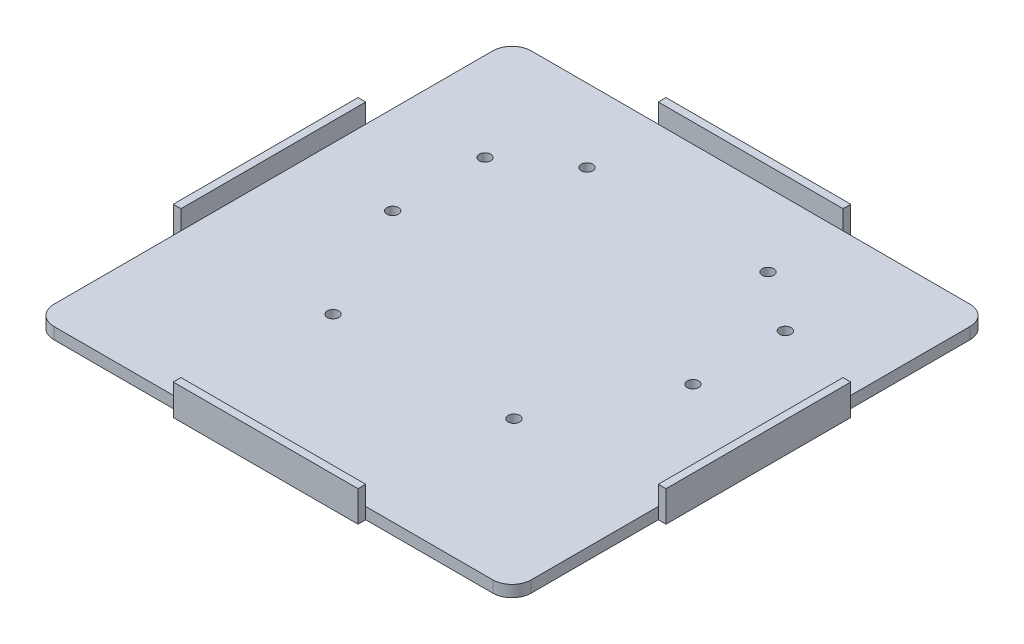
ISO-10303-21;
HEADER;
FILE_DESCRIPTION(('STEP AP214'),'2;1');
FILE_NAME('part.step','',(''),(''),'','','');
FILE_SCHEMA(('AUTOMOTIVE_DESIGN { 1 0 10303 214 1 1 1 1 }'));
ENDSEC;
DATA;
#1=APPLICATION_CONTEXT('core data for automotive mechanical design processes');
#2=APPLICATION_PROTOCOL_DEFINITION('international standard','automotive_design',2000,#1);
#3=PRODUCT_CONTEXT('',#1,'mechanical');
#4=PRODUCT('Part','Part','',(#3));
#5=PRODUCT_RELATED_PRODUCT_CATEGORY('part','',(#4));
#6=PRODUCT_DEFINITION_FORMATION('','',#4);
#7=PRODUCT_DEFINITION_CONTEXT('part definition',#1,'design');
#8=PRODUCT_DEFINITION('design','',#6,#7);
#9=PRODUCT_DEFINITION_SHAPE('','',#8);
#10=(LENGTH_UNIT() NAMED_UNIT(*) SI_UNIT(.MILLI.,.METRE.));
#11=(NAMED_UNIT(*) PLANE_ANGLE_UNIT() SI_UNIT($,.RADIAN.));
#12=(NAMED_UNIT(*) SI_UNIT($,.STERADIAN.) SOLID_ANGLE_UNIT());
#13=UNCERTAINTY_MEASURE_WITH_UNIT(LENGTH_MEASURE(1.E-05),#10,'distance_accuracy_value','');
#14=(GEOMETRIC_REPRESENTATION_CONTEXT(3) GLOBAL_UNCERTAINTY_ASSIGNED_CONTEXT((#13)) GLOBAL_UNIT_ASSIGNED_CONTEXT((#10,
#11,#12)) REPRESENTATION_CONTEXT('',''));
#15=CARTESIAN_POINT('',(0.,0.,0.));
#16=DIRECTION('',(0.,0.,1.));
#17=DIRECTION('',(1.,0.,0.));
#18=AXIS2_PLACEMENT_3D('',#15,#16,#17);
#19=CARTESIAN_POINT('',(0.,8.,0.));
#20=DIRECTION('',(0.,1.,0.));
#21=DIRECTION('',(0.,0.,1.));
#22=AXIS2_PLACEMENT_3D('',#19,#20,#21);
#23=PLANE('',#22);
#24=DIRECTION('',(0.,0.,1.));
#25=VECTOR('',#24,1.);
#26=CARTESIAN_POINT('',(-62.,8.,62.));
#27=LINE('',#26,#25);
#28=CARTESIAN_POINT('',(-62.,8.,-24.));
#29=VERTEX_POINT('',#28);
#30=CARTESIAN_POINT('',(-62.,8.,24.));
#31=VERTEX_POINT('',#30);
#32=EDGE_CURVE('E371',#29,#31,#27,.T.);
#33=ORIENTED_EDGE('',*,*,#32,.F.);
#34=DIRECTION('',(1.,0.,0.));
#35=VECTOR('',#34,1.);
#36=CARTESIAN_POINT('',(-64.,8.,-24.));
#37=LINE('',#36,#35);
#38=CARTESIAN_POINT('',(-64.,8.,-24.));
#39=VERTEX_POINT('',#38);
#40=EDGE_CURVE('E278',#39,#29,#37,.T.);
#41=ORIENTED_EDGE('',*,*,#40,.F.);
#42=DIRECTION('',(0.,0.,1.));
#43=VECTOR('',#42,1.);
#44=CARTESIAN_POINT('',(-64.,8.,-64.));
#45=LINE('',#44,#43);
#46=CARTESIAN_POINT('',(-64.,8.,24.));
#47=VERTEX_POINT('',#46);
#48=EDGE_CURVE('E300',#39,#47,#45,.T.);
#49=ORIENTED_EDGE('',*,*,#48,.T.);
#50=DIRECTION('',(-1.,0.,0.));
#51=VECTOR('',#50,1.);
#52=CARTESIAN_POINT('',(-64.,8.,24.));
#53=LINE('',#52,#51);
#54=EDGE_CURVE('E401',#31,#47,#53,.T.);
#55=ORIENTED_EDGE('',*,*,#54,.F.);
#56=EDGE_LOOP('',(#33,#41,#49,#55));
#57=FACE_BOUND('',#56,.T.);
#58=ADVANCED_FACE('F35',(#57),#23,.T.);
#59=DIRECTION('',(-1.,0.,0.));
#60=VECTOR('',#59,1.);
#61=CARTESIAN_POINT('',(-62.,8.,-62.));
#62=LINE('',#61,#60);
#63=CARTESIAN_POINT('',(24.,8.,-62.));
#64=VERTEX_POINT('',#63);
#65=CARTESIAN_POINT('',(-24.,8.,-62.));
#66=VERTEX_POINT('',#65);
#67=EDGE_CURVE('E223',#64,#66,#62,.T.);
#68=ORIENTED_EDGE('',*,*,#67,.F.);
#69=DIRECTION('',(0.,0.,1.));
#70=VECTOR('',#69,1.);
#71=CARTESIAN_POINT('',(24.,8.,-62.));
#72=LINE('',#71,#70);
#73=CARTESIAN_POINT('',(24.,8.,-64.));
#74=VERTEX_POINT('',#73);
#75=EDGE_CURVE('E239',#74,#64,#72,.T.);
#76=ORIENTED_EDGE('',*,*,#75,.F.);
#77=DIRECTION('',(-1.,0.,0.));
#78=VECTOR('',#77,1.);
#79=CARTESIAN_POINT('',(-64.,8.,-64.));
#80=LINE('',#79,#78);
#81=CARTESIAN_POINT('',(-24.,8.,-64.));
#82=VERTEX_POINT('',#81);
#83=EDGE_CURVE('E297',#74,#82,#80,.T.);
#84=ORIENTED_EDGE('',*,*,#83,.T.);
#85=DIRECTION('',(0.,0.,-1.));
#86=VECTOR('',#85,1.);
#87=CARTESIAN_POINT('',(-24.,8.,-62.));
#88=LINE('',#87,#86);
#89=EDGE_CURVE('E241',#66,#82,#88,.T.);
#90=ORIENTED_EDGE('',*,*,#89,.F.);
#91=EDGE_LOOP('',(#68,#76,#84,#90));
#92=FACE_BOUND('',#91,.T.);
#93=ADVANCED_FACE('F237',(#92),#23,.T.);
#94=DIRECTION('',(0.,0.,-1.));
#95=VECTOR('',#94,1.);
#96=CARTESIAN_POINT('',(62.,8.,-62.));
#97=LINE('',#96,#95);
#98=CARTESIAN_POINT('',(62.,8.,24.));
#99=VERTEX_POINT('',#98);
#100=CARTESIAN_POINT('',(62.,8.,-24.));
#101=VERTEX_POINT('',#100);
#102=EDGE_CURVE('E243',#99,#101,#97,.T.);
#103=ORIENTED_EDGE('',*,*,#102,.F.);
#104=DIRECTION('',(-1.,0.,0.));
#105=VECTOR('',#104,1.);
#106=CARTESIAN_POINT('',(64.,8.,24.));
#107=LINE('',#106,#105);
#108=CARTESIAN_POINT('',(64.,8.,24.));
#109=VERTEX_POINT('',#108);
#110=EDGE_CURVE('E427',#109,#99,#107,.T.);
#111=ORIENTED_EDGE('',*,*,#110,.F.);
#112=DIRECTION('',(0.,0.,-1.));
#113=VECTOR('',#112,1.);
#114=CARTESIAN_POINT('',(64.,8.,-64.));
#115=LINE('',#114,#113);
#116=CARTESIAN_POINT('',(64.,8.,-24.));
#117=VERTEX_POINT('',#116);
#118=EDGE_CURVE('E294',#109,#117,#115,.T.);
#119=ORIENTED_EDGE('',*,*,#118,.T.);
#120=DIRECTION('',(1.,0.,0.));
#121=VECTOR('',#120,1.);
#122=CARTESIAN_POINT('',(64.,8.,-24.));
#123=LINE('',#122,#121);
#124=EDGE_CURVE('E247',#101,#117,#123,.T.);
#125=ORIENTED_EDGE('',*,*,#124,.F.);
#126=EDGE_LOOP('',(#103,#111,#119,#125));
#127=FACE_BOUND('',#126,.T.);
#128=ADVANCED_FACE('F472',(#127),#23,.T.);
#129=CARTESIAN_POINT('',(64.,8.,-64.));
#130=DIRECTION('',(-1.,0.,0.));
#131=DIRECTION('',(0.,0.,1.));
#132=AXIS2_PLACEMENT_3D('',#129,#130,#131);
#133=PLANE('',#132);
#134=DIRECTION('',(0.,0.,-1.));
#135=VECTOR('',#134,1.);
#136=CARTESIAN_POINT('',(64.,0.,-64.));
#137=LINE('',#136,#135);
#138=CARTESIAN_POINT('',(64.,0.,24.));
#139=VERTEX_POINT('',#138);
#140=CARTESIAN_POINT('',(64.,0.,-24.));
#141=VERTEX_POINT('',#140);
#142=EDGE_CURVE('E286',#139,#141,#137,.T.);
#143=ORIENTED_EDGE('',*,*,#142,.T.);
#144=DIRECTION('',(0.,1.,0.));
#145=VECTOR('',#144,1.);
#146=CARTESIAN_POINT('',(64.,0.,-24.));
#147=LINE('',#146,#145);
#148=EDGE_CURVE('E259',#141,#117,#147,.T.);
#149=ORIENTED_EDGE('',*,*,#148,.T.);
#150=ORIENTED_EDGE('',*,*,#118,.F.);
#151=DIRECTION('',(0.,1.,0.));
#152=VECTOR('',#151,1.);
#153=CARTESIAN_POINT('',(64.,0.,24.));
#154=LINE('',#153,#152);
#155=EDGE_CURVE('E442',#139,#109,#154,.T.);
#156=ORIENTED_EDGE('',*,*,#155,.F.);
#157=EDGE_LOOP('',(#143,#149,#150,#156));
#158=FACE_BOUND('',#157,.T.);
#159=ADVANCED_FACE('F465',(#158),#133,.F.);
#160=CARTESIAN_POINT('',(-64.,8.,-64.));
#161=DIRECTION('',(0.,0.,1.));
#162=DIRECTION('',(1.,0.,0.));
#163=AXIS2_PLACEMENT_3D('',#160,#161,#162);
#164=PLANE('',#163);
#165=ORIENTED_EDGE('',*,*,#83,.F.);
#166=DIRECTION('',(0.,1.,0.));
#167=VECTOR('',#166,1.);
#168=CARTESIAN_POINT('',(24.,0.,-64.));
#169=LINE('',#168,#167);
#170=CARTESIAN_POINT('',(24.,0.,-64.));
#171=VERTEX_POINT('',#170);
#172=EDGE_CURVE('E232',#171,#74,#169,.T.);
#173=ORIENTED_EDGE('',*,*,#172,.F.);
#174=DIRECTION('',(-1.,0.,0.));
#175=VECTOR('',#174,1.);
#176=CARTESIAN_POINT('',(-64.,0.,-64.));
#177=LINE('',#176,#175);
#178=CARTESIAN_POINT('',(-24.,0.,-64.));
#179=VERTEX_POINT('',#178);
#180=EDGE_CURVE('E309',#171,#179,#177,.T.);
#181=ORIENTED_EDGE('',*,*,#180,.T.);
#182=DIRECTION('',(0.,1.,0.));
#183=VECTOR('',#182,1.);
#184=CARTESIAN_POINT('',(-24.,0.,-64.));
#185=LINE('',#184,#183);
#186=EDGE_CURVE('E283',#179,#82,#185,.T.);
#187=ORIENTED_EDGE('',*,*,#186,.T.);
#188=EDGE_LOOP('',(#165,#173,#181,#187));
#189=FACE_BOUND('',#188,.T.);
#190=ADVANCED_FACE('F504',(#189),#164,.F.);
#191=CARTESIAN_POINT('',(-64.,8.,-64.));
#192=DIRECTION('',(1.,0.,0.));
#193=DIRECTION('',(0.,0.,-1.));
#194=AXIS2_PLACEMENT_3D('',#191,#192,#193);
#195=PLANE('',#194);
#196=DIRECTION('',(0.,0.,1.));
#197=VECTOR('',#196,1.);
#198=CARTESIAN_POINT('',(-64.,0.,-64.));
#199=LINE('',#198,#197);
#200=CARTESIAN_POINT('',(-64.,0.,-24.));
#201=VERTEX_POINT('',#200);
#202=CARTESIAN_POINT('',(-64.,0.,24.));
#203=VERTEX_POINT('',#202);
#204=EDGE_CURVE('E312',#201,#203,#199,.T.);
#205=ORIENTED_EDGE('',*,*,#204,.T.);
#206=DIRECTION('',(0.,1.,0.));
#207=VECTOR('',#206,1.);
#208=CARTESIAN_POINT('',(-64.,0.,24.));
#209=LINE('',#208,#207);
#210=EDGE_CURVE('E281',#203,#47,#209,.T.);
#211=ORIENTED_EDGE('',*,*,#210,.T.);
#212=ORIENTED_EDGE('',*,*,#48,.F.);
#213=DIRECTION('',(0.,1.,0.));
#214=VECTOR('',#213,1.);
#215=CARTESIAN_POINT('',(-64.,0.,-24.));
#216=LINE('',#215,#214);
#217=EDGE_CURVE('E277',#201,#39,#216,.T.);
#218=ORIENTED_EDGE('',*,*,#217,.F.);
#219=EDGE_LOOP('',(#205,#211,#212,#218));
#220=FACE_BOUND('',#219,.T.);
#221=ADVANCED_FACE('F533',(#220),#195,.F.);
#222=CARTESIAN_POINT('',(-64.,8.,64.));
#223=DIRECTION('',(0.,0.,-1.));
#224=DIRECTION('',(-1.,0.,0.));
#225=AXIS2_PLACEMENT_3D('',#222,#223,#224);
#226=PLANE('',#225);
#227=DIRECTION('',(1.,0.,0.));
#228=VECTOR('',#227,1.);
#229=CARTESIAN_POINT('',(-64.,0.,64.));
#230=LINE('',#229,#228);
#231=CARTESIAN_POINT('',(-24.,0.,64.));
#232=VERTEX_POINT('',#231);
#233=CARTESIAN_POINT('',(24.,0.,64.));
#234=VERTEX_POINT('',#233);
#235=EDGE_CURVE('E298',#232,#234,#230,.T.);
#236=ORIENTED_EDGE('',*,*,#235,.T.);
#237=DIRECTION('',(0.,1.,0.));
#238=VECTOR('',#237,1.);
#239=CARTESIAN_POINT('',(24.,0.,64.));
#240=LINE('',#239,#238);
#241=CARTESIAN_POINT('',(24.,8.,64.));
#242=VERTEX_POINT('',#241);
#243=EDGE_CURVE('E444',#234,#242,#240,.T.);
#244=ORIENTED_EDGE('',*,*,#243,.T.);
#245=DIRECTION('',(1.,0.,0.));
#246=VECTOR('',#245,1.);
#247=CARTESIAN_POINT('',(-64.,8.,64.));
#248=LINE('',#247,#246);
#249=CARTESIAN_POINT('',(-24.,8.,64.));
#250=VERTEX_POINT('',#249);
#251=EDGE_CURVE('E303',#250,#242,#248,.T.);
#252=ORIENTED_EDGE('',*,*,#251,.F.);
#253=DIRECTION('',(0.,1.,0.));
#254=VECTOR('',#253,1.);
#255=CARTESIAN_POINT('',(-24.,0.,64.));
#256=LINE('',#255,#254);
#257=EDGE_CURVE('E409',#232,#250,#256,.T.);
#258=ORIENTED_EDGE('',*,*,#257,.F.);
#259=EDGE_LOOP('',(#236,#244,#252,#258));
#260=FACE_BOUND('',#259,.T.);
#261=ADVANCED_FACE('F563',(#260),#226,.F.);
#262=DIRECTION('',(1.,0.,0.));
#263=VECTOR('',#262,1.);
#264=CARTESIAN_POINT('',(62.,8.,62.));
#265=LINE('',#264,#263);
#266=CARTESIAN_POINT('',(-24.,8.,62.));
#267=VERTEX_POINT('',#266);
#268=CARTESIAN_POINT('',(24.,8.,62.));
#269=VERTEX_POINT('',#268);
#270=EDGE_CURVE('E374',#267,#269,#265,.T.);
#271=ORIENTED_EDGE('',*,*,#270,.F.);
#272=DIRECTION('',(0.,0.,-1.));
#273=VECTOR('',#272,1.);
#274=CARTESIAN_POINT('',(-24.,8.,62.));
#275=LINE('',#274,#273);
#276=EDGE_CURVE('E410',#250,#267,#275,.T.);
#277=ORIENTED_EDGE('',*,*,#276,.F.);
#278=ORIENTED_EDGE('',*,*,#251,.T.);
#279=DIRECTION('',(0.,0.,1.));
#280=VECTOR('',#279,1.);
#281=CARTESIAN_POINT('',(24.,8.,62.));
#282=LINE('',#281,#280);
#283=EDGE_CURVE('E262',#269,#242,#282,.T.);
#284=ORIENTED_EDGE('',*,*,#283,.F.);
#285=EDGE_LOOP('',(#271,#277,#278,#284));
#286=FACE_BOUND('',#285,.T.);
#287=ADVANCED_FACE('F571',(#286),#23,.T.);
#288=CARTESIAN_POINT('',(0.,0.,0.));
#289=DIRECTION('',(0.,1.,0.));
#290=DIRECTION('',(0.,0.,1.));
#291=AXIS2_PLACEMENT_3D('',#288,#289,#290);
#292=PLANE('',#291);
#293=CARTESIAN_POINT('',(-39.,0.,-32.));
#294=DIRECTION('',(0.,-1.,0.));
#295=DIRECTION('',(0.,0.,-1.));
#296=AXIS2_PLACEMENT_3D('',#293,#294,#295);
#297=CIRCLE('',#296,1.5);
#298=CARTESIAN_POINT('',(-39.,0.,-33.5));
#299=VERTEX_POINT('',#298);
#300=EDGE_CURVE('E924',#299,#299,#297,.T.);
#301=ORIENTED_EDGE('',*,*,#300,.F.);
#302=EDGE_LOOP('',(#301));
#303=FACE_BOUND('',#302,.T.);
#304=CARTESIAN_POINT('',(23.5,0.,23.));
#305=DIRECTION('',(0.,-1.,0.));
#306=DIRECTION('',(0.,0.,1.));
#307=AXIS2_PLACEMENT_3D('',#304,#305,#306);
#308=CIRCLE('',#307,1.5);
#309=CARTESIAN_POINT('',(23.5,0.,24.5));
#310=VERTEX_POINT('',#309);
#311=EDGE_CURVE('E925',#310,#310,#308,.T.);
#312=ORIENTED_EDGE('',*,*,#311,.F.);
#313=EDGE_LOOP('',(#312));
#314=FACE_BOUND('',#313,.T.);
#315=CARTESIAN_POINT('',(-23.5,0.,23.));
#316=DIRECTION('',(0.,-1.,0.));
#317=DIRECTION('',(0.,0.,-1.));
#318=AXIS2_PLACEMENT_3D('',#315,#316,#317);
#319=CIRCLE('',#318,1.5);
#320=CARTESIAN_POINT('',(-23.5,0.,21.5));
#321=VERTEX_POINT('',#320);
#322=EDGE_CURVE('E929',#321,#321,#319,.T.);
#323=ORIENTED_EDGE('',*,*,#322,.F.);
#324=EDGE_LOOP('',(#323));
#325=FACE_BOUND('',#324,.T.);
#326=CARTESIAN_POINT('',(23.5,0.,-43.));
#327=DIRECTION('',(0.,-1.,0.));
#328=DIRECTION('',(0.,0.,1.));
#329=AXIS2_PLACEMENT_3D('',#326,#327,#328);
#330=CIRCLE('',#329,1.5);
#331=CARTESIAN_POINT('',(23.5,0.,-41.5));
#332=VERTEX_POINT('',#331);
#333=EDGE_CURVE('E936',#332,#332,#330,.T.);
#334=ORIENTED_EDGE('',*,*,#333,.F.);
#335=EDGE_LOOP('',(#334));
#336=FACE_BOUND('',#335,.T.);
#337=CARTESIAN_POINT('',(39.,0.,-7.99999999999998));
#338=DIRECTION('',(0.,-1.,0.));
#339=DIRECTION('',(0.,0.,1.));
#340=AXIS2_PLACEMENT_3D('',#337,#338,#339);
#341=CIRCLE('',#340,1.5);
#342=CARTESIAN_POINT('',(39.,0.,-6.49999999999998));
#343=VERTEX_POINT('',#342);
#344=EDGE_CURVE('E955',#343,#343,#341,.T.);
#345=ORIENTED_EDGE('',*,*,#344,.F.);
#346=EDGE_LOOP('',(#345));
#347=FACE_BOUND('',#346,.T.);
#348=CARTESIAN_POINT('',(-39.,0.,-7.99999999999999));
#349=DIRECTION('',(0.,-1.,0.));
#350=DIRECTION('',(0.,0.,-1.));
#351=AXIS2_PLACEMENT_3D('',#348,#349,#350);
#352=CIRCLE('',#351,1.5);
#353=CARTESIAN_POINT('',(-39.,0.,-9.5));
#354=VERTEX_POINT('',#353);
#355=EDGE_CURVE('E932',#354,#354,#352,.T.);
#356=ORIENTED_EDGE('',*,*,#355,.F.);
#357=EDGE_LOOP('',(#356));
#358=FACE_BOUND('',#357,.T.);
#359=CARTESIAN_POINT('',(39.,0.,-32.));
#360=DIRECTION('',(0.,-1.,0.));
#361=DIRECTION('',(0.,0.,1.));
#362=AXIS2_PLACEMENT_3D('',#359,#360,#361);
#363=CIRCLE('',#362,1.5);
#364=CARTESIAN_POINT('',(39.,0.,-30.5));
#365=VERTEX_POINT('',#364);
#366=EDGE_CURVE('E926',#365,#365,#363,.T.);
#367=ORIENTED_EDGE('',*,*,#366,.F.);
#368=EDGE_LOOP('',(#367));
#369=FACE_BOUND('',#368,.T.);
#370=CARTESIAN_POINT('',(-23.5,0.,-43.));
#371=DIRECTION('',(0.,-1.,0.));
#372=DIRECTION('',(0.,0.,-1.));
#373=AXIS2_PLACEMENT_3D('',#370,#371,#372);
#374=CIRCLE('',#373,1.5);
#375=CARTESIAN_POINT('',(-23.5,0.,-44.5));
#376=VERTEX_POINT('',#375);
#377=EDGE_CURVE('E352',#376,#376,#374,.T.);
#378=ORIENTED_EDGE('',*,*,#377,.F.);
#379=EDGE_LOOP('',(#378));
#380=FACE_BOUND('',#379,.T.);
#381=DIRECTION('',(0.,0.,-1.));
#382=VECTOR('',#381,1.);
#383=CARTESIAN_POINT('',(-62.,0.,-24.));
#384=LINE('',#383,#382);
#385=CARTESIAN_POINT('',(-62.,0.,-24.));
#386=VERTEX_POINT('',#385);
#387=CARTESIAN_POINT('',(-62.,0.,-57.));
#388=VERTEX_POINT('',#387);
#389=EDGE_CURVE('E270',#386,#388,#384,.T.);
#390=ORIENTED_EDGE('',*,*,#389,.T.);
#391=CARTESIAN_POINT('',(-57.,0.,-57.));
#392=DIRECTION('',(0.,1.,0.));
#393=DIRECTION('',(0.,0.,1.));
#394=AXIS2_PLACEMENT_3D('',#391,#392,#393);
#395=CIRCLE('',#394,5.);
#396=CARTESIAN_POINT('',(-57.,0.,-62.));
#397=VERTEX_POINT('',#396);
#398=EDGE_CURVE('E11',#388,#397,#395,.F.);
#399=ORIENTED_EDGE('',*,*,#398,.T.);
#400=DIRECTION('',(1.,0.,0.));
#401=VECTOR('',#400,1.);
#402=CARTESIAN_POINT('',(-62.,0.,-62.));
#403=LINE('',#402,#401);
#404=CARTESIAN_POINT('',(-24.,0.,-62.));
#405=VERTEX_POINT('',#404);
#406=EDGE_CURVE('E272',#397,#405,#403,.T.);
#407=ORIENTED_EDGE('',*,*,#406,.T.);
#408=DIRECTION('',(0.,0.,-1.));
#409=VECTOR('',#408,1.);
#410=CARTESIAN_POINT('',(-24.,0.,-62.));
#411=LINE('',#410,#409);
#412=EDGE_CURVE('E274',#405,#179,#411,.T.);
#413=ORIENTED_EDGE('',*,*,#412,.T.);
#414=ORIENTED_EDGE('',*,*,#180,.F.);
#415=DIRECTION('',(0.,0.,1.));
#416=VECTOR('',#415,1.);
#417=CARTESIAN_POINT('',(24.,0.,-62.));
#418=LINE('',#417,#416);
#419=CARTESIAN_POINT('',(24.,0.,-62.));
#420=VERTEX_POINT('',#419);
#421=EDGE_CURVE('E250',#171,#420,#418,.T.);
#422=ORIENTED_EDGE('',*,*,#421,.T.);
#423=DIRECTION('',(1.,0.,0.));
#424=VECTOR('',#423,1.);
#425=CARTESIAN_POINT('',(62.,0.,-62.));
#426=LINE('',#425,#424);
#427=CARTESIAN_POINT('',(57.,0.,-62.));
#428=VERTEX_POINT('',#427);
#429=EDGE_CURVE('E452',#420,#428,#426,.T.);
#430=ORIENTED_EDGE('',*,*,#429,.T.);
#431=CARTESIAN_POINT('',(57.,0.,-57.));
#432=DIRECTION('',(0.,1.,0.));
#433=DIRECTION('',(0.,0.,1.));
#434=AXIS2_PLACEMENT_3D('',#431,#432,#433);
#435=CIRCLE('',#434,5.);
#436=CARTESIAN_POINT('',(62.,0.,-57.));
#437=VERTEX_POINT('',#436);
#438=EDGE_CURVE('E341',#428,#437,#435,.F.);
#439=ORIENTED_EDGE('',*,*,#438,.T.);
#440=DIRECTION('',(0.,0.,1.));
#441=VECTOR('',#440,1.);
#442=CARTESIAN_POINT('',(62.,0.,-24.));
#443=LINE('',#442,#441);
#444=CARTESIAN_POINT('',(62.,0.,-24.));
#445=VERTEX_POINT('',#444);
#446=EDGE_CURVE('E454',#437,#445,#443,.T.);
#447=ORIENTED_EDGE('',*,*,#446,.T.);
#448=DIRECTION('',(1.,0.,0.));
#449=VECTOR('',#448,1.);
#450=CARTESIAN_POINT('',(64.,0.,-24.));
#451=LINE('',#450,#449);
#452=EDGE_CURVE('E256',#445,#141,#451,.T.);
#453=ORIENTED_EDGE('',*,*,#452,.T.);
#454=ORIENTED_EDGE('',*,*,#142,.F.);
#455=DIRECTION('',(-1.,0.,0.));
#456=VECTOR('',#455,1.);
#457=CARTESIAN_POINT('',(64.,0.,24.));
#458=LINE('',#457,#456);
#459=CARTESIAN_POINT('',(62.,0.,24.));
#460=VERTEX_POINT('',#459);
#461=EDGE_CURVE('E430',#139,#460,#458,.T.);
#462=ORIENTED_EDGE('',*,*,#461,.T.);
#463=DIRECTION('',(0.,0.,1.));
#464=VECTOR('',#463,1.);
#465=CARTESIAN_POINT('',(62.,0.,24.));
#466=LINE('',#465,#464);
#467=CARTESIAN_POINT('',(62.,0.,57.));
#468=VERTEX_POINT('',#467);
#469=EDGE_CURVE('E433',#460,#468,#466,.T.);
#470=ORIENTED_EDGE('',*,*,#469,.T.);
#471=CARTESIAN_POINT('',(57.,0.,57.));
#472=DIRECTION('',(0.,1.,0.));
#473=DIRECTION('',(0.,0.,1.));
#474=AXIS2_PLACEMENT_3D('',#471,#472,#473);
#475=CIRCLE('',#474,5.);
#476=CARTESIAN_POINT('',(57.,0.,62.));
#477=VERTEX_POINT('',#476);
#478=EDGE_CURVE('E332',#468,#477,#475,.F.);
#479=ORIENTED_EDGE('',*,*,#478,.T.);
#480=DIRECTION('',(-1.,0.,0.));
#481=VECTOR('',#480,1.);
#482=CARTESIAN_POINT('',(62.,0.,62.));
#483=LINE('',#482,#481);
#484=CARTESIAN_POINT('',(24.,0.,62.));
#485=VERTEX_POINT('',#484);
#486=EDGE_CURVE('E424',#477,#485,#483,.T.);
#487=ORIENTED_EDGE('',*,*,#486,.T.);
#488=DIRECTION('',(0.,0.,1.));
#489=VECTOR('',#488,1.);
#490=CARTESIAN_POINT('',(24.,0.,62.));
#491=LINE('',#490,#489);
#492=EDGE_CURVE('E426',#485,#234,#491,.T.);
#493=ORIENTED_EDGE('',*,*,#492,.T.);
#494=ORIENTED_EDGE('',*,*,#235,.F.);
#495=DIRECTION('',(0.,0.,-1.));
#496=VECTOR('',#495,1.);
#497=CARTESIAN_POINT('',(-24.,0.,62.));
#498=LINE('',#497,#496);
#499=CARTESIAN_POINT('',(-24.,0.,62.));
#500=VERTEX_POINT('',#499);
#501=EDGE_CURVE('E397',#232,#500,#498,.T.);
#502=ORIENTED_EDGE('',*,*,#501,.T.);
#503=DIRECTION('',(-1.,0.,0.));
#504=VECTOR('',#503,1.);
#505=CARTESIAN_POINT('',(-62.,0.,62.));
#506=LINE('',#505,#504);
#507=CARTESIAN_POINT('',(-57.,0.,62.));
#508=VERTEX_POINT('',#507);
#509=EDGE_CURVE('E400',#500,#508,#506,.T.);
#510=ORIENTED_EDGE('',*,*,#509,.T.);
#511=CARTESIAN_POINT('',(-57.,0.,57.));
#512=DIRECTION('',(0.,1.,0.));
#513=DIRECTION('',(0.,0.,1.));
#514=AXIS2_PLACEMENT_3D('',#511,#512,#513);
#515=CIRCLE('',#514,5.);
#516=CARTESIAN_POINT('',(-62.,0.,57.));
#517=VERTEX_POINT('',#516);
#518=EDGE_CURVE('E323',#508,#517,#515,.F.);
#519=ORIENTED_EDGE('',*,*,#518,.T.);
#520=DIRECTION('',(0.,0.,-1.));
#521=VECTOR('',#520,1.);
#522=CARTESIAN_POINT('',(-62.,0.,24.));
#523=LINE('',#522,#521);
#524=CARTESIAN_POINT('',(-62.,0.,24.));
#525=VERTEX_POINT('',#524);
#526=EDGE_CURVE('E404',#517,#525,#523,.T.);
#527=ORIENTED_EDGE('',*,*,#526,.T.);
#528=DIRECTION('',(-1.,0.,0.));
#529=VECTOR('',#528,1.);
#530=CARTESIAN_POINT('',(-64.,0.,24.));
#531=LINE('',#530,#529);
#532=EDGE_CURVE('E406',#525,#203,#531,.T.);
#533=ORIENTED_EDGE('',*,*,#532,.T.);
#534=ORIENTED_EDGE('',*,*,#204,.F.);
#535=DIRECTION('',(1.,0.,0.));
#536=VECTOR('',#535,1.);
#537=CARTESIAN_POINT('',(-64.,0.,-24.));
#538=LINE('',#537,#536);
#539=EDGE_CURVE('E267',#201,#386,#538,.T.);
#540=ORIENTED_EDGE('',*,*,#539,.T.);
#541=EDGE_LOOP('',(#390,#399,#407,#413,#414,#422,#430,#439,#447,#453,#454,#462,#470,#479,#487,
#493,#494,#502,#510,#519,#527,#533,#534,#540));
#542=FACE_BOUND('',#541,.T.);
#543=ADVANCED_FACE('F461',(#303,#314,#325,#336,#347,#358,#369,#380,#542),#292,.F.);
#544=CARTESIAN_POINT('',(-24.,0.,-62.));
#545=DIRECTION('',(1.,0.,0.));
#546=DIRECTION('',(0.,0.,-1.));
#547=AXIS2_PLACEMENT_3D('',#544,#545,#546);
#548=PLANE('',#547);
#549=ORIENTED_EDGE('',*,*,#89,.T.);
#550=ORIENTED_EDGE('',*,*,#186,.F.);
#551=ORIENTED_EDGE('',*,*,#412,.F.);
#552=DIRECTION('',(0.,1.,0.));
#553=VECTOR('',#552,1.);
#554=CARTESIAN_POINT('',(-24.,0.,-62.));
#555=LINE('',#554,#553);
#556=CARTESIAN_POINT('',(-24.,3.,-62.));
#557=VERTEX_POINT('',#556);
#558=EDGE_CURVE('E287',#405,#557,#555,.T.);
#559=ORIENTED_EDGE('',*,*,#558,.T.);
#560=DIRECTION('',(0.,1.,0.));
#561=VECTOR('',#560,1.);
#562=CARTESIAN_POINT('',(-24.,0.,-62.));
#563=LINE('',#562,#561);
#564=EDGE_CURVE('E385',#557,#66,#563,.T.);
#565=ORIENTED_EDGE('',*,*,#564,.T.);
#566=EDGE_LOOP('',(#549,#550,#551,#559,#565));
#567=FACE_BOUND('',#566,.T.);
#568=ADVANCED_FACE('F509',(#567),#548,.F.);
#569=CARTESIAN_POINT('',(-62.,0.,-62.));
#570=DIRECTION('',(0.,0.,1.));
#571=DIRECTION('',(1.,0.,0.));
#572=AXIS2_PLACEMENT_3D('',#569,#570,#571);
#573=PLANE('',#572);
#574=ORIENTED_EDGE('',*,*,#406,.F.);
#575=DIRECTION('',(0.,1.,0.));
#576=VECTOR('',#575,1.);
#577=CARTESIAN_POINT('',(-57.,0.,-62.));
#578=LINE('',#577,#576);
#579=CARTESIAN_POINT('',(-57.,3.,-62.));
#580=VERTEX_POINT('',#579);
#581=EDGE_CURVE('E343',#397,#580,#578,.T.);
#582=ORIENTED_EDGE('',*,*,#581,.T.);
#583=DIRECTION('',(-1.,0.,0.));
#584=VECTOR('',#583,1.);
#585=CARTESIAN_POINT('',(-62.,3.,-62.));
#586=LINE('',#585,#584);
#587=EDGE_CURVE('E491',#557,#580,#586,.T.);
#588=ORIENTED_EDGE('',*,*,#587,.F.);
#589=ORIENTED_EDGE('',*,*,#558,.F.);
#590=EDGE_LOOP('',(#574,#582,#588,#589));
#591=FACE_BOUND('',#590,.T.);
#592=ADVANCED_FACE('F511',(#591),#573,.F.);
#593=CARTESIAN_POINT('',(-62.,0.,-24.));
#594=DIRECTION('',(1.,0.,0.));
#595=DIRECTION('',(0.,0.,-1.));
#596=AXIS2_PLACEMENT_3D('',#593,#594,#595);
#597=PLANE('',#596);
#598=DIRECTION('',(0.,0.,1.));
#599=VECTOR('',#598,1.);
#600=CARTESIAN_POINT('',(-62.,3.,62.));
#601=LINE('',#600,#599);
#602=CARTESIAN_POINT('',(-62.,3.,-57.));
#603=VERTEX_POINT('',#602);
#604=CARTESIAN_POINT('',(-62.,3.,-24.));
#605=VERTEX_POINT('',#604);
#606=EDGE_CURVE('E542',#603,#605,#601,.T.);
#607=ORIENTED_EDGE('',*,*,#606,.F.);
#608=DIRECTION('',(0.,1.,0.));
#609=VECTOR('',#608,1.);
#610=CARTESIAN_POINT('',(-62.,0.,-57.));
#611=LINE('',#610,#609);
#612=EDGE_CURVE('E44',#603,#388,#611,.F.);
#613=ORIENTED_EDGE('',*,*,#612,.T.);
#614=ORIENTED_EDGE('',*,*,#389,.F.);
#615=DIRECTION('',(0.,1.,0.));
#616=VECTOR('',#615,1.);
#617=CARTESIAN_POINT('',(-62.,0.,-24.));
#618=LINE('',#617,#616);
#619=EDGE_CURVE('E290',#386,#605,#618,.T.);
#620=ORIENTED_EDGE('',*,*,#619,.T.);
#621=EDGE_LOOP('',(#607,#613,#614,#620));
#622=FACE_BOUND('',#621,.T.);
#623=ADVANCED_FACE('F517',(#622),#597,.F.);
#624=CARTESIAN_POINT('',(-64.,0.,-24.));
#625=DIRECTION('',(0.,0.,1.));
#626=DIRECTION('',(1.,0.,0.));
#627=AXIS2_PLACEMENT_3D('',#624,#625,#626);
#628=PLANE('',#627);
#629=ORIENTED_EDGE('',*,*,#40,.T.);
#630=DIRECTION('',(0.,-1.,0.));
#631=VECTOR('',#630,1.);
#632=CARTESIAN_POINT('',(-62.,0.,-24.));
#633=LINE('',#632,#631);
#634=EDGE_CURVE('E248',#29,#605,#633,.T.);
#635=ORIENTED_EDGE('',*,*,#634,.T.);
#636=ORIENTED_EDGE('',*,*,#619,.F.);
#637=ORIENTED_EDGE('',*,*,#539,.F.);
#638=ORIENTED_EDGE('',*,*,#217,.T.);
#639=EDGE_LOOP('',(#629,#635,#636,#637,#638));
#640=FACE_BOUND('',#639,.T.);
#641=ADVANCED_FACE('F519',(#640),#628,.F.);
#642=CARTESIAN_POINT('',(-64.,0.,24.));
#643=DIRECTION('',(0.,0.,-1.));
#644=DIRECTION('',(-1.,0.,0.));
#645=AXIS2_PLACEMENT_3D('',#642,#643,#644);
#646=PLANE('',#645);
#647=ORIENTED_EDGE('',*,*,#54,.T.);
#648=ORIENTED_EDGE('',*,*,#210,.F.);
#649=ORIENTED_EDGE('',*,*,#532,.F.);
#650=DIRECTION('',(0.,1.,0.));
#651=VECTOR('',#650,1.);
#652=CARTESIAN_POINT('',(-62.,0.,24.));
#653=LINE('',#652,#651);
#654=CARTESIAN_POINT('',(-62.,3.,24.));
#655=VERTEX_POINT('',#654);
#656=EDGE_CURVE('E417',#525,#655,#653,.T.);
#657=ORIENTED_EDGE('',*,*,#656,.T.);
#658=DIRECTION('',(0.,1.,0.));
#659=VECTOR('',#658,1.);
#660=CARTESIAN_POINT('',(-62.,0.,24.));
#661=LINE('',#660,#659);
#662=EDGE_CURVE('E253',#655,#31,#661,.T.);
#663=ORIENTED_EDGE('',*,*,#662,.T.);
#664=EDGE_LOOP('',(#647,#648,#649,#657,#663));
#665=FACE_BOUND('',#664,.T.);
#666=ADVANCED_FACE('F530',(#665),#646,.F.);
#667=CARTESIAN_POINT('',(-62.,0.,24.));
#668=DIRECTION('',(1.,0.,0.));
#669=DIRECTION('',(0.,0.,-1.));
#670=AXIS2_PLACEMENT_3D('',#667,#668,#669);
#671=PLANE('',#670);
#672=ORIENTED_EDGE('',*,*,#526,.F.);
#673=DIRECTION('',(0.,1.,0.));
#674=VECTOR('',#673,1.);
#675=CARTESIAN_POINT('',(-62.,0.,57.));
#676=LINE('',#675,#674);
#677=CARTESIAN_POINT('',(-62.,3.,57.));
#678=VERTEX_POINT('',#677);
#679=EDGE_CURVE('E306',#517,#678,#676,.T.);
#680=ORIENTED_EDGE('',*,*,#679,.T.);
#681=EDGE_CURVE('E242',#655,#678,#601,.T.);
#682=ORIENTED_EDGE('',*,*,#681,.F.);
#683=ORIENTED_EDGE('',*,*,#656,.F.);
#684=EDGE_LOOP('',(#672,#680,#682,#683));
#685=FACE_BOUND('',#684,.T.);
#686=ADVANCED_FACE('F538',(#685),#671,.F.);
#687=CARTESIAN_POINT('',(-62.,0.,62.));
#688=DIRECTION('',(0.,0.,-1.));
#689=DIRECTION('',(-1.,0.,0.));
#690=AXIS2_PLACEMENT_3D('',#687,#688,#689);
#691=PLANE('',#690);
#692=DIRECTION('',(1.,0.,0.));
#693=VECTOR('',#692,1.);
#694=CARTESIAN_POINT('',(62.,3.,62.));
#695=LINE('',#694,#693);
#696=CARTESIAN_POINT('',(-57.,3.,62.));
#697=VERTEX_POINT('',#696);
#698=CARTESIAN_POINT('',(-24.,3.,62.));
#699=VERTEX_POINT('',#698);
#700=EDGE_CURVE('E486',#697,#699,#695,.T.);
#701=ORIENTED_EDGE('',*,*,#700,.F.);
#702=DIRECTION('',(0.,1.,0.));
#703=VECTOR('',#702,1.);
#704=CARTESIAN_POINT('',(-57.,0.,62.));
#705=LINE('',#704,#703);
#706=EDGE_CURVE('E321',#697,#508,#705,.F.);
#707=ORIENTED_EDGE('',*,*,#706,.T.);
#708=ORIENTED_EDGE('',*,*,#509,.F.);
#709=DIRECTION('',(0.,1.,0.));
#710=VECTOR('',#709,1.);
#711=CARTESIAN_POINT('',(-24.,0.,62.));
#712=LINE('',#711,#710);
#713=EDGE_CURVE('E420',#500,#699,#712,.T.);
#714=ORIENTED_EDGE('',*,*,#713,.T.);
#715=EDGE_LOOP('',(#701,#707,#708,#714));
#716=FACE_BOUND('',#715,.T.);
#717=ADVANCED_FACE('F574',(#716),#691,.F.);
#718=CARTESIAN_POINT('',(-24.,0.,62.));
#719=DIRECTION('',(1.,0.,0.));
#720=DIRECTION('',(0.,0.,-1.));
#721=AXIS2_PLACEMENT_3D('',#718,#719,#720);
#722=PLANE('',#721);
#723=ORIENTED_EDGE('',*,*,#276,.T.);
#724=DIRECTION('',(0.,-1.,0.));
#725=VECTOR('',#724,1.);
#726=CARTESIAN_POINT('',(-24.,0.,62.));
#727=LINE('',#726,#725);
#728=EDGE_CURVE('E393',#267,#699,#727,.T.);
#729=ORIENTED_EDGE('',*,*,#728,.T.);
#730=ORIENTED_EDGE('',*,*,#713,.F.);
#731=ORIENTED_EDGE('',*,*,#501,.F.);
#732=ORIENTED_EDGE('',*,*,#257,.T.);
#733=EDGE_LOOP('',(#723,#729,#730,#731,#732));
#734=FACE_BOUND('',#733,.T.);
#735=ADVANCED_FACE('F567',(#734),#722,.F.);
#736=CARTESIAN_POINT('',(62.,0.,62.));
#737=DIRECTION('',(0.,0.,-1.));
#738=DIRECTION('',(-1.,0.,0.));
#739=AXIS2_PLACEMENT_3D('',#736,#737,#738);
#740=PLANE('',#739);
#741=ORIENTED_EDGE('',*,*,#486,.F.);
#742=DIRECTION('',(0.,1.,0.));
#743=VECTOR('',#742,1.);
#744=CARTESIAN_POINT('',(57.,0.,62.));
#745=LINE('',#744,#743);
#746=CARTESIAN_POINT('',(57.,3.,62.));
#747=VERTEX_POINT('',#746);
#748=EDGE_CURVE('E325',#477,#747,#745,.T.);
#749=ORIENTED_EDGE('',*,*,#748,.T.);
#750=CARTESIAN_POINT('',(24.,3.,62.));
#751=VERTEX_POINT('',#750);
#752=EDGE_CURVE('E490',#751,#747,#695,.T.);
#753=ORIENTED_EDGE('',*,*,#752,.F.);
#754=DIRECTION('',(0.,1.,0.));
#755=VECTOR('',#754,1.);
#756=CARTESIAN_POINT('',(24.,0.,62.));
#757=LINE('',#756,#755);
#758=EDGE_CURVE('E447',#485,#751,#757,.T.);
#759=ORIENTED_EDGE('',*,*,#758,.F.);
#760=EDGE_LOOP('',(#741,#749,#753,#759));
#761=FACE_BOUND('',#760,.T.);
#762=ADVANCED_FACE('F553',(#761),#740,.F.);
#763=CARTESIAN_POINT('',(62.,0.,24.));
#764=DIRECTION('',(-1.,0.,0.));
#765=DIRECTION('',(0.,0.,1.));
#766=AXIS2_PLACEMENT_3D('',#763,#764,#765);
#767=PLANE('',#766);
#768=DIRECTION('',(0.,0.,-1.));
#769=VECTOR('',#768,1.);
#770=CARTESIAN_POINT('',(62.,3.,-62.));
#771=LINE('',#770,#769);
#772=CARTESIAN_POINT('',(62.,3.,57.));
#773=VERTEX_POINT('',#772);
#774=CARTESIAN_POINT('',(62.,3.,24.));
#775=VERTEX_POINT('',#774);
#776=EDGE_CURVE('E487',#773,#775,#771,.T.);
#777=ORIENTED_EDGE('',*,*,#776,.F.);
#778=DIRECTION('',(0.,1.,0.));
#779=VECTOR('',#778,1.);
#780=CARTESIAN_POINT('',(62.,0.,57.));
#781=LINE('',#780,#779);
#782=EDGE_CURVE('E330',#773,#468,#781,.F.);
#783=ORIENTED_EDGE('',*,*,#782,.T.);
#784=ORIENTED_EDGE('',*,*,#469,.F.);
#785=DIRECTION('',(0.,1.,0.));
#786=VECTOR('',#785,1.);
#787=CARTESIAN_POINT('',(62.,0.,24.));
#788=LINE('',#787,#786);
#789=EDGE_CURVE('E413',#460,#775,#788,.T.);
#790=ORIENTED_EDGE('',*,*,#789,.T.);
#791=EDGE_LOOP('',(#777,#783,#784,#790));
#792=FACE_BOUND('',#791,.T.);
#793=ADVANCED_FACE('F693',(#792),#767,.F.);
#794=CARTESIAN_POINT('',(64.,0.,24.));
#795=DIRECTION('',(0.,0.,-1.));
#796=DIRECTION('',(-1.,0.,0.));
#797=AXIS2_PLACEMENT_3D('',#794,#795,#796);
#798=PLANE('',#797);
#799=ORIENTED_EDGE('',*,*,#110,.T.);
#800=DIRECTION('',(0.,-1.,0.));
#801=VECTOR('',#800,1.);
#802=CARTESIAN_POINT('',(62.,0.,24.));
#803=LINE('',#802,#801);
#804=EDGE_CURVE('E390',#99,#775,#803,.T.);
#805=ORIENTED_EDGE('',*,*,#804,.T.);
#806=ORIENTED_EDGE('',*,*,#789,.F.);
#807=ORIENTED_EDGE('',*,*,#461,.F.);
#808=ORIENTED_EDGE('',*,*,#155,.T.);
#809=EDGE_LOOP('',(#799,#805,#806,#807,#808));
#810=FACE_BOUND('',#809,.T.);
#811=ADVANCED_FACE('F469',(#810),#798,.F.);
#812=CARTESIAN_POINT('',(24.,0.,62.));
#813=DIRECTION('',(-1.,0.,0.));
#814=DIRECTION('',(0.,0.,1.));
#815=AXIS2_PLACEMENT_3D('',#812,#813,#814);
#816=PLANE('',#815);
#817=ORIENTED_EDGE('',*,*,#283,.T.);
#818=ORIENTED_EDGE('',*,*,#243,.F.);
#819=ORIENTED_EDGE('',*,*,#492,.F.);
#820=ORIENTED_EDGE('',*,*,#758,.T.);
#821=EDGE_CURVE('E436',#751,#269,#757,.T.);
#822=ORIENTED_EDGE('',*,*,#821,.T.);
#823=EDGE_LOOP('',(#817,#818,#819,#820,#822));
#824=FACE_BOUND('',#823,.T.);
#825=ADVANCED_FACE('F558',(#824),#816,.F.);
#826=CARTESIAN_POINT('',(64.,0.,-24.));
#827=DIRECTION('',(0.,0.,1.));
#828=DIRECTION('',(1.,0.,0.));
#829=AXIS2_PLACEMENT_3D('',#826,#827,#828);
#830=PLANE('',#829);
#831=ORIENTED_EDGE('',*,*,#124,.T.);
#832=ORIENTED_EDGE('',*,*,#148,.F.);
#833=ORIENTED_EDGE('',*,*,#452,.F.);
#834=DIRECTION('',(0.,1.,0.));
#835=VECTOR('',#834,1.);
#836=CARTESIAN_POINT('',(62.,0.,-24.));
#837=LINE('',#836,#835);
#838=CARTESIAN_POINT('',(62.,3.,-24.));
#839=VERTEX_POINT('',#838);
#840=EDGE_CURVE('E263',#445,#839,#837,.T.);
#841=ORIENTED_EDGE('',*,*,#840,.T.);
#842=DIRECTION('',(0.,1.,0.));
#843=VECTOR('',#842,1.);
#844=CARTESIAN_POINT('',(62.,0.,-24.));
#845=LINE('',#844,#843);
#846=EDGE_CURVE('E387',#839,#101,#845,.T.);
#847=ORIENTED_EDGE('',*,*,#846,.T.);
#848=EDGE_LOOP('',(#831,#832,#833,#841,#847));
#849=FACE_BOUND('',#848,.T.);
#850=ADVANCED_FACE('F478',(#849),#830,.F.);
#851=CARTESIAN_POINT('',(62.,0.,-24.));
#852=DIRECTION('',(-1.,0.,0.));
#853=DIRECTION('',(0.,0.,1.));
#854=AXIS2_PLACEMENT_3D('',#851,#852,#853);
#855=PLANE('',#854);
#856=ORIENTED_EDGE('',*,*,#446,.F.);
#857=DIRECTION('',(0.,1.,0.));
#858=VECTOR('',#857,1.);
#859=CARTESIAN_POINT('',(62.,0.,-57.));
#860=LINE('',#859,#858);
#861=CARTESIAN_POINT('',(62.,3.,-57.));
#862=VERTEX_POINT('',#861);
#863=EDGE_CURVE('E334',#437,#862,#860,.T.);
#864=ORIENTED_EDGE('',*,*,#863,.T.);
#865=EDGE_CURVE('E484',#839,#862,#771,.T.);
#866=ORIENTED_EDGE('',*,*,#865,.F.);
#867=ORIENTED_EDGE('',*,*,#840,.F.);
#868=EDGE_LOOP('',(#856,#864,#866,#867));
#869=FACE_BOUND('',#868,.T.);
#870=ADVANCED_FACE('F481',(#869),#855,.F.);
#871=CARTESIAN_POINT('',(62.,0.,-62.));
#872=DIRECTION('',(0.,0.,1.));
#873=DIRECTION('',(1.,0.,0.));
#874=AXIS2_PLACEMENT_3D('',#871,#872,#873);
#875=PLANE('',#874);
#876=CARTESIAN_POINT('',(57.,3.,-62.));
#877=VERTEX_POINT('',#876);
#878=CARTESIAN_POINT('',(24.,3.,-62.));
#879=VERTEX_POINT('',#878);
#880=EDGE_CURVE('E381',#877,#879,#586,.T.);
#881=ORIENTED_EDGE('',*,*,#880,.F.);
#882=DIRECTION('',(0.,1.,0.));
#883=VECTOR('',#882,1.);
#884=CARTESIAN_POINT('',(57.,0.,-62.));
#885=LINE('',#884,#883);
#886=EDGE_CURVE('E339',#877,#428,#885,.F.);
#887=ORIENTED_EDGE('',*,*,#886,.T.);
#888=ORIENTED_EDGE('',*,*,#429,.F.);
#889=DIRECTION('',(0.,1.,0.));
#890=VECTOR('',#889,1.);
#891=CARTESIAN_POINT('',(24.,0.,-62.));
#892=LINE('',#891,#890);
#893=EDGE_CURVE('E231',#420,#879,#892,.T.);
#894=ORIENTED_EDGE('',*,*,#893,.T.);
#895=EDGE_LOOP('',(#881,#887,#888,#894));
#896=FACE_BOUND('',#895,.T.);
#897=ADVANCED_FACE('F498',(#896),#875,.F.);
#898=CARTESIAN_POINT('',(24.,0.,-62.));
#899=DIRECTION('',(-1.,0.,0.));
#900=DIRECTION('',(0.,0.,1.));
#901=AXIS2_PLACEMENT_3D('',#898,#899,#900);
#902=PLANE('',#901);
#903=ORIENTED_EDGE('',*,*,#75,.T.);
#904=EDGE_CURVE('E220',#879,#64,#892,.T.);
#905=ORIENTED_EDGE('',*,*,#904,.F.);
#906=ORIENTED_EDGE('',*,*,#893,.F.);
#907=ORIENTED_EDGE('',*,*,#421,.F.);
#908=ORIENTED_EDGE('',*,*,#172,.T.);
#909=EDGE_LOOP('',(#903,#905,#906,#907,#908));
#910=FACE_BOUND('',#909,.T.);
#911=ADVANCED_FACE('F245',(#910),#902,.F.);
#912=CARTESIAN_POINT('',(-62.,3.,62.));
#913=DIRECTION('',(-1.,0.,0.));
#914=DIRECTION('',(0.,0.,1.));
#915=AXIS2_PLACEMENT_3D('',#912,#913,#914);
#916=PLANE('',#915);
#917=ORIENTED_EDGE('',*,*,#32,.T.);
#918=ORIENTED_EDGE('',*,*,#662,.F.);
#919=EDGE_CURVE('E525',#605,#655,#601,.T.);
#920=ORIENTED_EDGE('',*,*,#919,.F.);
#921=ORIENTED_EDGE('',*,*,#634,.F.);
#922=EDGE_LOOP('',(#917,#918,#920,#921));
#923=FACE_BOUND('',#922,.T.);
#924=ADVANCED_FACE('F523',(#923),#916,.F.);
#925=CARTESIAN_POINT('',(62.,3.,62.));
#926=DIRECTION('',(0.,0.,1.));
#927=DIRECTION('',(1.,0.,0.));
#928=AXIS2_PLACEMENT_3D('',#925,#926,#927);
#929=PLANE('',#928);
#930=ORIENTED_EDGE('',*,*,#270,.T.);
#931=ORIENTED_EDGE('',*,*,#821,.F.);
#932=EDGE_CURVE('E488',#699,#751,#695,.T.);
#933=ORIENTED_EDGE('',*,*,#932,.F.);
#934=ORIENTED_EDGE('',*,*,#728,.F.);
#935=EDGE_LOOP('',(#930,#931,#933,#934));
#936=FACE_BOUND('',#935,.T.);
#937=ADVANCED_FACE('F572',(#936),#929,.F.);
#938=CARTESIAN_POINT('',(62.,3.,-62.));
#939=DIRECTION('',(1.,0.,0.));
#940=DIRECTION('',(0.,0.,-1.));
#941=AXIS2_PLACEMENT_3D('',#938,#939,#940);
#942=PLANE('',#941);
#943=ORIENTED_EDGE('',*,*,#102,.T.);
#944=ORIENTED_EDGE('',*,*,#846,.F.);
#945=EDGE_CURVE('E485',#775,#839,#771,.T.);
#946=ORIENTED_EDGE('',*,*,#945,.F.);
#947=ORIENTED_EDGE('',*,*,#804,.F.);
#948=EDGE_LOOP('',(#943,#944,#946,#947));
#949=FACE_BOUND('',#948,.T.);
#950=ADVANCED_FACE('F475',(#949),#942,.F.);
#951=CARTESIAN_POINT('',(-62.,3.,-62.));
#952=DIRECTION('',(0.,0.,-1.));
#953=DIRECTION('',(-1.,0.,0.));
#954=AXIS2_PLACEMENT_3D('',#951,#952,#953);
#955=PLANE('',#954);
#956=EDGE_CURVE('E226',#879,#557,#586,.T.);
#957=ORIENTED_EDGE('',*,*,#956,.F.);
#958=ORIENTED_EDGE('',*,*,#904,.T.);
#959=ORIENTED_EDGE('',*,*,#67,.T.);
#960=ORIENTED_EDGE('',*,*,#564,.F.);
#961=EDGE_LOOP('',(#957,#958,#959,#960));
#962=FACE_BOUND('',#961,.T.);
#963=ADVANCED_FACE('F222',(#962),#955,.F.);
#964=CARTESIAN_POINT('',(0.,3.,0.));
#965=DIRECTION('',(0.,-1.,0.));
#966=DIRECTION('',(0.,0.,-1.));
#967=AXIS2_PLACEMENT_3D('',#964,#965,#966);
#968=PLANE('',#967);
#969=CARTESIAN_POINT('',(-39.,3.,-32.));
#970=DIRECTION('',(0.,-1.,0.));
#971=DIRECTION('',(0.,0.,-1.));
#972=AXIS2_PLACEMENT_3D('',#969,#970,#971);
#973=CIRCLE('',#972,1.5);
#974=CARTESIAN_POINT('',(-39.,3.,-33.5));
#975=VERTEX_POINT('',#974);
#976=EDGE_CURVE('E39',#975,#975,#973,.T.);
#977=ORIENTED_EDGE('',*,*,#976,.T.);
#978=EDGE_LOOP('',(#977));
#979=FACE_BOUND('',#978,.T.);
#980=CARTESIAN_POINT('',(23.5,3.,23.));
#981=DIRECTION('',(0.,-1.,0.));
#982=DIRECTION('',(0.,0.,-1.));
#983=AXIS2_PLACEMENT_3D('',#980,#981,#982);
#984=CIRCLE('',#983,1.5);
#985=CARTESIAN_POINT('',(23.5,3.,21.5));
#986=VERTEX_POINT('',#985);
#987=EDGE_CURVE('E366',#986,#986,#984,.T.);
#988=ORIENTED_EDGE('',*,*,#987,.T.);
#989=EDGE_LOOP('',(#988));
#990=FACE_BOUND('',#989,.T.);
#991=CARTESIAN_POINT('',(-23.5,3.,23.));
#992=DIRECTION('',(0.,-1.,0.));
#993=DIRECTION('',(0.,0.,-1.));
#994=AXIS2_PLACEMENT_3D('',#991,#992,#993);
#995=CIRCLE('',#994,1.5);
#996=CARTESIAN_POINT('',(-23.5,3.,21.5));
#997=VERTEX_POINT('',#996);
#998=EDGE_CURVE('E364',#997,#997,#995,.T.);
#999=ORIENTED_EDGE('',*,*,#998,.T.);
#1000=EDGE_LOOP('',(#999));
#1001=FACE_BOUND('',#1000,.T.);
#1002=CARTESIAN_POINT('',(23.5,3.,-43.));
#1003=DIRECTION('',(0.,-1.,0.));
#1004=DIRECTION('',(0.,0.,-1.));
#1005=AXIS2_PLACEMENT_3D('',#1002,#1003,#1004);
#1006=CIRCLE('',#1005,1.5);
#1007=CARTESIAN_POINT('',(23.5,3.,-44.5));
#1008=VERTEX_POINT('',#1007);
#1009=EDGE_CURVE('E361',#1008,#1008,#1006,.T.);
#1010=ORIENTED_EDGE('',*,*,#1009,.T.);
#1011=EDGE_LOOP('',(#1010));
#1012=FACE_BOUND('',#1011,.T.);
#1013=CARTESIAN_POINT('',(39.,3.,-7.99999999999998));
#1014=DIRECTION('',(0.,-1.,0.));
#1015=DIRECTION('',(0.,0.,-1.));
#1016=AXIS2_PLACEMENT_3D('',#1013,#1014,#1015);
#1017=CIRCLE('',#1016,1.5);
#1018=CARTESIAN_POINT('',(39.,3.,-9.49999999999999));
#1019=VERTEX_POINT('',#1018);
#1020=EDGE_CURVE('E358',#1019,#1019,#1017,.T.);
#1021=ORIENTED_EDGE('',*,*,#1020,.T.);
#1022=EDGE_LOOP('',(#1021));
#1023=FACE_BOUND('',#1022,.T.);
#1024=CARTESIAN_POINT('',(-39.,3.,-7.99999999999999));
#1025=DIRECTION('',(0.,-1.,0.));
#1026=DIRECTION('',(0.,0.,-1.));
#1027=AXIS2_PLACEMENT_3D('',#1024,#1025,#1026);
#1028=CIRCLE('',#1027,1.5);
#1029=CARTESIAN_POINT('',(-39.,3.,-9.5));
#1030=VERTEX_POINT('',#1029);
#1031=EDGE_CURVE('E355',#1030,#1030,#1028,.T.);
#1032=ORIENTED_EDGE('',*,*,#1031,.T.);
#1033=EDGE_LOOP('',(#1032));
#1034=FACE_BOUND('',#1033,.T.);
#1035=CARTESIAN_POINT('',(39.,3.,-32.));
#1036=DIRECTION('',(0.,-1.,0.));
#1037=DIRECTION('',(0.,0.,-1.));
#1038=AXIS2_PLACEMENT_3D('',#1035,#1036,#1037);
#1039=CIRCLE('',#1038,1.5);
#1040=CARTESIAN_POINT('',(39.,3.,-33.5));
#1041=VERTEX_POINT('',#1040);
#1042=EDGE_CURVE('E351',#1041,#1041,#1039,.T.);
#1043=ORIENTED_EDGE('',*,*,#1042,.T.);
#1044=EDGE_LOOP('',(#1043));
#1045=FACE_BOUND('',#1044,.T.);
#1046=CARTESIAN_POINT('',(-23.5,3.,-43.));
#1047=DIRECTION('',(0.,-1.,0.));
#1048=DIRECTION('',(0.,0.,-1.));
#1049=AXIS2_PLACEMENT_3D('',#1046,#1047,#1048);
#1050=CIRCLE('',#1049,1.5);
#1051=CARTESIAN_POINT('',(-23.5,3.,-44.5));
#1052=VERTEX_POINT('',#1051);
#1053=EDGE_CURVE('E348',#1052,#1052,#1050,.T.);
#1054=ORIENTED_EDGE('',*,*,#1053,.T.);
#1055=EDGE_LOOP('',(#1054));
#1056=FACE_BOUND('',#1055,.T.);
#1057=ORIENTED_EDGE('',*,*,#587,.T.);
#1058=CARTESIAN_POINT('',(-57.,3.,-57.));
#1059=DIRECTION('',(0.,-1.,0.));
#1060=DIRECTION('',(0.,0.,-1.));
#1061=AXIS2_PLACEMENT_3D('',#1058,#1059,#1060);
#1062=CIRCLE('',#1061,5.);
#1063=EDGE_CURVE('E59',#580,#603,#1062,.F.);
#1064=ORIENTED_EDGE('',*,*,#1063,.T.);
#1065=ORIENTED_EDGE('',*,*,#606,.T.);
#1066=ORIENTED_EDGE('',*,*,#919,.T.);
#1067=ORIENTED_EDGE('',*,*,#681,.T.);
#1068=CARTESIAN_POINT('',(-57.,3.,57.));
#1069=DIRECTION('',(0.,-1.,0.));
#1070=DIRECTION('',(0.,0.,-1.));
#1071=AXIS2_PLACEMENT_3D('',#1068,#1069,#1070);
#1072=CIRCLE('',#1071,5.);
#1073=EDGE_CURVE('E319',#678,#697,#1072,.F.);
#1074=ORIENTED_EDGE('',*,*,#1073,.T.);
#1075=ORIENTED_EDGE('',*,*,#700,.T.);
#1076=ORIENTED_EDGE('',*,*,#932,.T.);
#1077=ORIENTED_EDGE('',*,*,#752,.T.);
#1078=CARTESIAN_POINT('',(57.,3.,57.));
#1079=DIRECTION('',(0.,-1.,0.));
#1080=DIRECTION('',(0.,0.,-1.));
#1081=AXIS2_PLACEMENT_3D('',#1078,#1079,#1080);
#1082=CIRCLE('',#1081,5.);
#1083=EDGE_CURVE('E328',#747,#773,#1082,.F.);
#1084=ORIENTED_EDGE('',*,*,#1083,.T.);
#1085=ORIENTED_EDGE('',*,*,#776,.T.);
#1086=ORIENTED_EDGE('',*,*,#945,.T.);
#1087=ORIENTED_EDGE('',*,*,#865,.T.);
#1088=CARTESIAN_POINT('',(57.,3.,-57.));
#1089=DIRECTION('',(0.,-1.,0.));
#1090=DIRECTION('',(0.,0.,-1.));
#1091=AXIS2_PLACEMENT_3D('',#1088,#1089,#1090);
#1092=CIRCLE('',#1091,5.);
#1093=EDGE_CURVE('E337',#862,#877,#1092,.F.);
#1094=ORIENTED_EDGE('',*,*,#1093,.T.);
#1095=ORIENTED_EDGE('',*,*,#880,.T.);
#1096=ORIENTED_EDGE('',*,*,#956,.T.);
#1097=EDGE_LOOP('',(#1057,#1064,#1065,#1066,#1067,#1074,#1075,#1076,#1077,#1084,#1085,#1086,
#1087,#1094,#1095,#1096));
#1098=FACE_BOUND('',#1097,.T.);
#1099=ADVANCED_FACE('F495',(#979,#990,#1001,#1012,#1023,#1034,#1045,#1056,#1098),#968,.F.);
#1100=CARTESIAN_POINT('',(-57.,0.,57.));
#1101=DIRECTION('',(0.,1.,0.));
#1102=DIRECTION('',(0.,0.,1.));
#1103=AXIS2_PLACEMENT_3D('',#1100,#1101,#1102);
#1104=CYLINDRICAL_SURFACE('',#1103,5.);
#1105=ORIENTED_EDGE('',*,*,#518,.F.);
#1106=ORIENTED_EDGE('',*,*,#706,.F.);
#1107=ORIENTED_EDGE('',*,*,#1073,.F.);
#1108=ORIENTED_EDGE('',*,*,#679,.F.);
#1109=EDGE_LOOP('',(#1105,#1106,#1107,#1108));
#1110=FACE_BOUND('',#1109,.T.);
#1111=ADVANCED_FACE('F578',(#1110),#1104,.T.);
#1112=CARTESIAN_POINT('',(57.,0.,57.));
#1113=DIRECTION('',(0.,1.,0.));
#1114=DIRECTION('',(0.,0.,1.));
#1115=AXIS2_PLACEMENT_3D('',#1112,#1113,#1114);
#1116=CYLINDRICAL_SURFACE('',#1115,5.);
#1117=ORIENTED_EDGE('',*,*,#478,.F.);
#1118=ORIENTED_EDGE('',*,*,#782,.F.);
#1119=ORIENTED_EDGE('',*,*,#1083,.F.);
#1120=ORIENTED_EDGE('',*,*,#748,.F.);
#1121=EDGE_LOOP('',(#1117,#1118,#1119,#1120));
#1122=FACE_BOUND('',#1121,.T.);
#1123=ADVANCED_FACE('F580',(#1122),#1116,.T.);
#1124=CARTESIAN_POINT('',(57.,0.,-57.));
#1125=DIRECTION('',(0.,1.,0.));
#1126=DIRECTION('',(0.,0.,1.));
#1127=AXIS2_PLACEMENT_3D('',#1124,#1125,#1126);
#1128=CYLINDRICAL_SURFACE('',#1127,5.);
#1129=ORIENTED_EDGE('',*,*,#438,.F.);
#1130=ORIENTED_EDGE('',*,*,#886,.F.);
#1131=ORIENTED_EDGE('',*,*,#1093,.F.);
#1132=ORIENTED_EDGE('',*,*,#863,.F.);
#1133=EDGE_LOOP('',(#1129,#1130,#1131,#1132));
#1134=FACE_BOUND('',#1133,.T.);
#1135=ADVANCED_FACE('F501',(#1134),#1128,.T.);
#1136=CARTESIAN_POINT('',(-57.,0.,-57.));
#1137=DIRECTION('',(0.,1.,0.));
#1138=DIRECTION('',(0.,0.,1.));
#1139=AXIS2_PLACEMENT_3D('',#1136,#1137,#1138);
#1140=CYLINDRICAL_SURFACE('',#1139,5.);
#1141=ORIENTED_EDGE('',*,*,#398,.F.);
#1142=ORIENTED_EDGE('',*,*,#612,.F.);
#1143=ORIENTED_EDGE('',*,*,#1063,.F.);
#1144=ORIENTED_EDGE('',*,*,#581,.F.);
#1145=EDGE_LOOP('',(#1141,#1142,#1143,#1144));
#1146=FACE_BOUND('',#1145,.T.);
#1147=ADVANCED_FACE('F37',(#1146),#1140,.T.);
#1148=CARTESIAN_POINT('',(-23.5,4.,-43.));
#1149=DIRECTION('',(0.,-1.,0.));
#1150=DIRECTION('',(0.,0.,-1.));
#1151=AXIS2_PLACEMENT_3D('',#1148,#1149,#1150);
#1152=CYLINDRICAL_SURFACE('',#1151,1.5);
#1153=ORIENTED_EDGE('',*,*,#377,.T.);
#1154=EDGE_LOOP('',(#1153));
#1155=FACE_BOUND('',#1154,.T.);
#1156=ORIENTED_EDGE('',*,*,#1053,.F.);
#1157=EDGE_LOOP('',(#1156));
#1158=FACE_BOUND('',#1157,.T.);
#1159=ADVANCED_FACE('F829',(#1155,#1158),#1152,.F.);
#1160=CARTESIAN_POINT('',(39.,4.,-32.));
#1161=DIRECTION('',(0.,-1.,0.));
#1162=DIRECTION('',(0.,0.,-1.));
#1163=AXIS2_PLACEMENT_3D('',#1160,#1161,#1162);
#1164=CYLINDRICAL_SURFACE('',#1163,1.5);
#1165=ORIENTED_EDGE('',*,*,#366,.T.);
#1166=EDGE_LOOP('',(#1165));
#1167=FACE_BOUND('',#1166,.T.);
#1168=ORIENTED_EDGE('',*,*,#1042,.F.);
#1169=EDGE_LOOP('',(#1168));
#1170=FACE_BOUND('',#1169,.T.);
#1171=ADVANCED_FACE('F847',(#1167,#1170),#1164,.F.);
#1172=CARTESIAN_POINT('',(-39.,4.,-7.99999999999999));
#1173=DIRECTION('',(0.,-1.,0.));
#1174=DIRECTION('',(0.,0.,-1.));
#1175=AXIS2_PLACEMENT_3D('',#1172,#1173,#1174);
#1176=CYLINDRICAL_SURFACE('',#1175,1.5);
#1177=ORIENTED_EDGE('',*,*,#355,.T.);
#1178=EDGE_LOOP('',(#1177));
#1179=FACE_BOUND('',#1178,.T.);
#1180=ORIENTED_EDGE('',*,*,#1031,.F.);
#1181=EDGE_LOOP('',(#1180));
#1182=FACE_BOUND('',#1181,.T.);
#1183=ADVANCED_FACE('F857',(#1179,#1182),#1176,.F.);
#1184=CARTESIAN_POINT('',(39.,4.,-7.99999999999998));
#1185=DIRECTION('',(0.,-1.,0.));
#1186=DIRECTION('',(0.,0.,-1.));
#1187=AXIS2_PLACEMENT_3D('',#1184,#1185,#1186);
#1188=CYLINDRICAL_SURFACE('',#1187,1.5);
#1189=ORIENTED_EDGE('',*,*,#344,.T.);
#1190=EDGE_LOOP('',(#1189));
#1191=FACE_BOUND('',#1190,.T.);
#1192=ORIENTED_EDGE('',*,*,#1020,.F.);
#1193=EDGE_LOOP('',(#1192));
#1194=FACE_BOUND('',#1193,.T.);
#1195=ADVANCED_FACE('F867',(#1191,#1194),#1188,.F.);
#1196=CARTESIAN_POINT('',(23.5,4.,-43.));
#1197=DIRECTION('',(0.,-1.,0.));
#1198=DIRECTION('',(0.,0.,-1.));
#1199=AXIS2_PLACEMENT_3D('',#1196,#1197,#1198);
#1200=CYLINDRICAL_SURFACE('',#1199,1.5);
#1201=ORIENTED_EDGE('',*,*,#333,.T.);
#1202=EDGE_LOOP('',(#1201));
#1203=FACE_BOUND('',#1202,.T.);
#1204=ORIENTED_EDGE('',*,*,#1009,.F.);
#1205=EDGE_LOOP('',(#1204));
#1206=FACE_BOUND('',#1205,.T.);
#1207=ADVANCED_FACE('F877',(#1203,#1206),#1200,.F.);
#1208=CARTESIAN_POINT('',(-23.5,4.,23.));
#1209=DIRECTION('',(0.,-1.,0.));
#1210=DIRECTION('',(0.,0.,-1.));
#1211=AXIS2_PLACEMENT_3D('',#1208,#1209,#1210);
#1212=CYLINDRICAL_SURFACE('',#1211,1.5);
#1213=ORIENTED_EDGE('',*,*,#322,.T.);
#1214=EDGE_LOOP('',(#1213));
#1215=FACE_BOUND('',#1214,.T.);
#1216=ORIENTED_EDGE('',*,*,#998,.F.);
#1217=EDGE_LOOP('',(#1216));
#1218=FACE_BOUND('',#1217,.T.);
#1219=ADVANCED_FACE('F887',(#1215,#1218),#1212,.F.);
#1220=CARTESIAN_POINT('',(23.5,4.,23.));
#1221=DIRECTION('',(0.,-1.,0.));
#1222=DIRECTION('',(0.,0.,-1.));
#1223=AXIS2_PLACEMENT_3D('',#1220,#1221,#1222);
#1224=CYLINDRICAL_SURFACE('',#1223,1.5);
#1225=ORIENTED_EDGE('',*,*,#311,.T.);
#1226=EDGE_LOOP('',(#1225));
#1227=FACE_BOUND('',#1226,.T.);
#1228=ORIENTED_EDGE('',*,*,#987,.F.);
#1229=EDGE_LOOP('',(#1228));
#1230=FACE_BOUND('',#1229,.T.);
#1231=ADVANCED_FACE('F897',(#1227,#1230),#1224,.F.);
#1232=CARTESIAN_POINT('',(-39.,4.,-32.));
#1233=DIRECTION('',(0.,-1.,0.));
#1234=DIRECTION('',(0.,0.,-1.));
#1235=AXIS2_PLACEMENT_3D('',#1232,#1233,#1234);
#1236=CYLINDRICAL_SURFACE('',#1235,1.5);
#1237=ORIENTED_EDGE('',*,*,#300,.T.);
#1238=EDGE_LOOP('',(#1237));
#1239=FACE_BOUND('',#1238,.T.);
#1240=ORIENTED_EDGE('',*,*,#976,.F.);
#1241=EDGE_LOOP('',(#1240));
#1242=FACE_BOUND('',#1241,.T.);
#1243=ADVANCED_FACE('F907',(#1239,#1242),#1236,.F.);
#1244=CLOSED_SHELL('',(#58,#93,#128,#159,#190,#221,#261,#287,#543,#568,#592,#623,#641,#666,#686,
#717,#735,#762,#793,#811,#825,#850,#870,#897,#911,#924,#937,#950,#963,#1099,#1111,#1123,#1135,
#1147,#1159,#1171,#1183,#1195,#1207,#1219,#1231,#1243));
#1245=MANIFOLD_SOLID_BREP('B2',#1244);
#1246=ADVANCED_BREP_SHAPE_REPRESENTATION('',(#18,#1245),#14);
#1247=SHAPE_DEFINITION_REPRESENTATION(#9,#1246);
ENDSEC;
END-ISO-10303-21;
